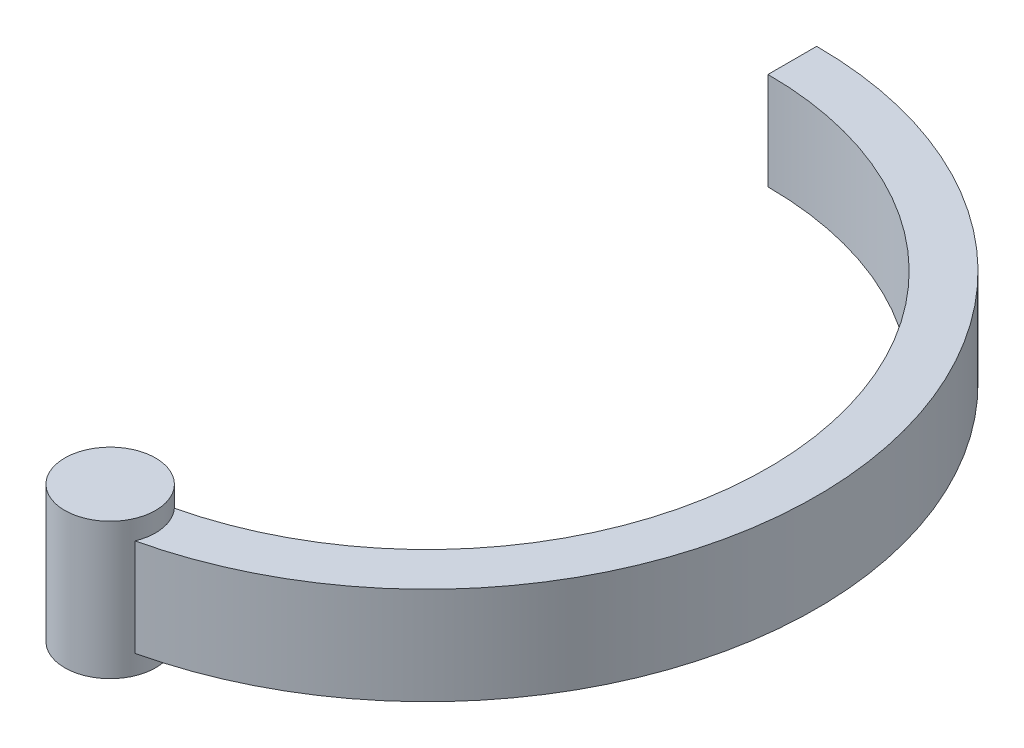
ISO-10303-21;
HEADER;
FILE_DESCRIPTION(('STEP AP214'),'2;1');
FILE_NAME('part.step','',(''),(''),'','','');
FILE_SCHEMA(('AUTOMOTIVE_DESIGN { 1 0 10303 214 1 1 1 1 }'));
ENDSEC;
DATA;
#1=APPLICATION_CONTEXT('core data for automotive mechanical design processes');
#2=APPLICATION_PROTOCOL_DEFINITION('international standard','automotive_design',2000,#1);
#3=PRODUCT_CONTEXT('',#1,'mechanical');
#4=PRODUCT('Part','Part','',(#3));
#5=PRODUCT_RELATED_PRODUCT_CATEGORY('part','',(#4));
#6=PRODUCT_DEFINITION_FORMATION('','',#4);
#7=PRODUCT_DEFINITION_CONTEXT('part definition',#1,'design');
#8=PRODUCT_DEFINITION('design','',#6,#7);
#9=PRODUCT_DEFINITION_SHAPE('','',#8);
#10=(LENGTH_UNIT() NAMED_UNIT(*) SI_UNIT(.MILLI.,.METRE.));
#11=(NAMED_UNIT(*) PLANE_ANGLE_UNIT() SI_UNIT($,.RADIAN.));
#12=(NAMED_UNIT(*) SI_UNIT($,.STERADIAN.) SOLID_ANGLE_UNIT());
#13=UNCERTAINTY_MEASURE_WITH_UNIT(LENGTH_MEASURE(1.E-05),#10,'distance_accuracy_value','');
#14=(GEOMETRIC_REPRESENTATION_CONTEXT(3) GLOBAL_UNCERTAINTY_ASSIGNED_CONTEXT((#13)) GLOBAL_UNIT_ASSIGNED_CONTEXT((#10,
#11,#12)) REPRESENTATION_CONTEXT('',''));
#15=CARTESIAN_POINT('',(0.,0.,0.));
#16=DIRECTION('',(0.,0.,1.));
#17=DIRECTION('',(1.,0.,0.));
#18=AXIS2_PLACEMENT_3D('',#15,#16,#17);
#19=CARTESIAN_POINT('',(4.66504640850441,-7.,37.208699816125));
#20=DIRECTION('',(0.,1.,0.));
#21=DIRECTION('',(0.,0.,1.));
#22=AXIS2_PLACEMENT_3D('',#19,#20,#21);
#23=CYLINDRICAL_SURFACE('',#22,4.66504640850441);
#24=CARTESIAN_POINT('',(4.66504640850441,7.,37.208699816125));
#25=DIRECTION('',(0.,1.,0.));
#26=DIRECTION('',(0.,0.,1.));
#27=AXIS2_PLACEMENT_3D('',#24,#25,#26);
#28=CIRCLE('',#27,4.66504640850441);
#29=CARTESIAN_POINT('',(4.66504640850441,7.,41.8737462246294));
#30=VERTEX_POINT('',#29);
#31=EDGE_CURVE('E42',#30,#30,#28,.T.);
#32=ORIENTED_EDGE('',*,*,#31,.F.);
#33=EDGE_LOOP('',(#32));
#34=FACE_BOUND('',#33,.T.);
#35=CARTESIAN_POINT('',(4.66504640850441,-7.,37.208699816125));
#36=DIRECTION('',(0.,1.,0.));
#37=DIRECTION('',(0.,0.,1.));
#38=AXIS2_PLACEMENT_3D('',#35,#36,#37);
#39=CIRCLE('',#38,4.66504640850441);
#40=CARTESIAN_POINT('',(4.66504640850441,-7.,41.8737462246294));
#41=VERTEX_POINT('',#40);
#42=EDGE_CURVE('E11',#41,#41,#39,.T.);
#43=ORIENTED_EDGE('',*,*,#42,.T.);
#44=EDGE_LOOP('',(#43));
#45=FACE_BOUND('',#44,.T.);
#46=DIRECTION('',(0.,1.,0.));
#47=VECTOR('',#46,1.);
#48=CARTESIAN_POINT('',(8.09823286131099,-5.,34.0502367763277));
#49=LINE('',#48,#47);
#50=CARTESIAN_POINT('',(8.09823286131099,-5.,34.0502367763277));
#51=VERTEX_POINT('',#50);
#52=CARTESIAN_POINT('',(8.09823286131105,5.,34.0502367763277));
#53=VERTEX_POINT('',#52);
#54=EDGE_CURVE('E49',#51,#53,#49,.T.);
#55=ORIENTED_EDGE('',*,*,#54,.F.);
#56=CARTESIAN_POINT('',(4.66504640850441,-5.,37.208699816125));
#57=DIRECTION('',(0.,-1.,0.));
#58=DIRECTION('',(0.,0.,1.));
#59=AXIS2_PLACEMENT_3D('',#56,#57,#58);
#60=CIRCLE('',#59,4.66504640850441);
#61=CARTESIAN_POINT('',(8.98127947699179,-5.,38.9786687683939));
#62=VERTEX_POINT('',#61);
#63=EDGE_CURVE('E53',#51,#62,#60,.T.);
#64=ORIENTED_EDGE('',*,*,#63,.T.);
#65=DIRECTION('',(0.,1.,0.));
#66=VECTOR('',#65,1.);
#67=CARTESIAN_POINT('',(8.9812794769918,-5.,38.9786687683939));
#68=LINE('',#67,#66);
#69=CARTESIAN_POINT('',(8.9812794769918,5.,38.9786687683939));
#70=VERTEX_POINT('',#69);
#71=EDGE_CURVE('E70',#62,#70,#68,.T.);
#72=ORIENTED_EDGE('',*,*,#71,.T.);
#73=CARTESIAN_POINT('',(4.66504640850441,5.,37.208699816125));
#74=DIRECTION('',(0.,-1.,0.));
#75=DIRECTION('',(0.,0.,1.));
#76=AXIS2_PLACEMENT_3D('',#73,#74,#75);
#77=CIRCLE('',#76,4.66504640850441);
#78=EDGE_CURVE('E72',#53,#70,#77,.T.);
#79=ORIENTED_EDGE('',*,*,#78,.F.);
#80=EDGE_LOOP('',(#55,#64,#72,#79));
#81=FACE_BOUND('',#80,.T.);
#82=ADVANCED_FACE('F35',(#34,#45,#81),#23,.T.);
#83=CARTESIAN_POINT('',(4.66504640850441,-7.,37.208699816125));
#84=DIRECTION('',(0.,1.,0.));
#85=DIRECTION('',(0.,0.,1.));
#86=AXIS2_PLACEMENT_3D('',#83,#84,#85);
#87=PLANE('',#86);
#88=ORIENTED_EDGE('',*,*,#42,.F.);
#89=EDGE_LOOP('',(#88));
#90=FACE_BOUND('',#89,.T.);
#91=ADVANCED_FACE('F114',(#90),#87,.F.);
#92=CARTESIAN_POINT('',(4.66504640850441,7.,37.208699816125));
#93=DIRECTION('',(0.,1.,0.));
#94=DIRECTION('',(0.,0.,1.));
#95=AXIS2_PLACEMENT_3D('',#92,#93,#94);
#96=PLANE('',#95);
#97=ORIENTED_EDGE('',*,*,#31,.T.);
#98=EDGE_LOOP('',(#97));
#99=FACE_BOUND('',#98,.T.);
#100=ADVANCED_FACE('F110',(#99),#96,.T.);
#101=CARTESIAN_POINT('',(0.,-5.,0.));
#102=DIRECTION('',(0.,1.,0.));
#103=DIRECTION('',(0.,0.,1.));
#104=AXIS2_PLACEMENT_3D('',#101,#102,#103);
#105=CYLINDRICAL_SURFACE('',#104,35.);
#106=ORIENTED_EDGE('',*,*,#54,.T.);
#107=CARTESIAN_POINT('',(0.,5.,0.));
#108=DIRECTION('',(0.,-1.,0.));
#109=DIRECTION('',(0.,0.,1.));
#110=AXIS2_PLACEMENT_3D('',#107,#108,#109);
#111=CIRCLE('',#110,35.);
#112=CARTESIAN_POINT('',(0.,5.,-35.));
#113=VERTEX_POINT('',#112);
#114=EDGE_CURVE('E87',#113,#53,#111,.T.);
#115=ORIENTED_EDGE('',*,*,#114,.F.);
#116=DIRECTION('',(0.,1.,0.));
#117=VECTOR('',#116,1.);
#118=CARTESIAN_POINT('',(0.,-5.,-35.));
#119=LINE('',#118,#117);
#120=CARTESIAN_POINT('',(0.,-5.,-35.));
#121=VERTEX_POINT('',#120);
#122=EDGE_CURVE('E104',#121,#113,#119,.T.);
#123=ORIENTED_EDGE('',*,*,#122,.F.);
#124=CARTESIAN_POINT('',(0.,-5.,0.));
#125=DIRECTION('',(0.,-1.,0.));
#126=DIRECTION('',(0.,0.,1.));
#127=AXIS2_PLACEMENT_3D('',#124,#125,#126);
#128=CIRCLE('',#127,35.);
#129=EDGE_CURVE('E92',#121,#51,#128,.T.);
#130=ORIENTED_EDGE('',*,*,#129,.T.);
#131=EDGE_LOOP('',(#106,#115,#123,#130));
#132=FACE_BOUND('',#131,.T.);
#133=ADVANCED_FACE('F121',(#132),#105,.F.);
#134=CARTESIAN_POINT('',(0.,-5.,-35.));
#135=DIRECTION('',(-1.,0.,0.));
#136=DIRECTION('',(0.,0.,1.));
#137=AXIS2_PLACEMENT_3D('',#134,#135,#136);
#138=PLANE('',#137);
#139=ORIENTED_EDGE('',*,*,#122,.T.);
#140=DIRECTION('',(0.,0.,1.));
#141=VECTOR('',#140,1.);
#142=CARTESIAN_POINT('',(0.,5.,-35.));
#143=LINE('',#142,#141);
#144=CARTESIAN_POINT('',(0.,5.,-40.));
#145=VERTEX_POINT('',#144);
#146=EDGE_CURVE('E90',#145,#113,#143,.T.);
#147=ORIENTED_EDGE('',*,*,#146,.F.);
#148=DIRECTION('',(0.,1.,0.));
#149=VECTOR('',#148,1.);
#150=CARTESIAN_POINT('',(0.,-5.,-40.));
#151=LINE('',#150,#149);
#152=CARTESIAN_POINT('',(0.,-5.,-40.));
#153=VERTEX_POINT('',#152);
#154=EDGE_CURVE('E77',#153,#145,#151,.T.);
#155=ORIENTED_EDGE('',*,*,#154,.F.);
#156=DIRECTION('',(0.,0.,1.));
#157=VECTOR('',#156,1.);
#158=CARTESIAN_POINT('',(0.,-5.,-35.));
#159=LINE('',#158,#157);
#160=EDGE_CURVE('E101',#153,#121,#159,.T.);
#161=ORIENTED_EDGE('',*,*,#160,.T.);
#162=EDGE_LOOP('',(#139,#147,#155,#161));
#163=FACE_BOUND('',#162,.T.);
#164=ADVANCED_FACE('F126',(#163),#138,.T.);
#165=CARTESIAN_POINT('',(0.,-5.,0.));
#166=DIRECTION('',(0.,1.,0.));
#167=DIRECTION('',(0.,0.,1.));
#168=AXIS2_PLACEMENT_3D('',#165,#166,#167);
#169=CYLINDRICAL_SURFACE('',#168,40.);
#170=ORIENTED_EDGE('',*,*,#154,.T.);
#171=CARTESIAN_POINT('',(0.,5.,0.));
#172=DIRECTION('',(0.,1.,0.));
#173=DIRECTION('',(0.,0.,1.));
#174=AXIS2_PLACEMENT_3D('',#171,#172,#173);
#175=CIRCLE('',#174,40.);
#176=EDGE_CURVE('E84',#70,#145,#175,.T.);
#177=ORIENTED_EDGE('',*,*,#176,.F.);
#178=ORIENTED_EDGE('',*,*,#71,.F.);
#179=CARTESIAN_POINT('',(0.,-5.,0.));
#180=DIRECTION('',(0.,1.,0.));
#181=DIRECTION('',(0.,0.,1.));
#182=AXIS2_PLACEMENT_3D('',#179,#180,#181);
#183=CIRCLE('',#182,40.);
#184=EDGE_CURVE('E99',#62,#153,#183,.T.);
#185=ORIENTED_EDGE('',*,*,#184,.T.);
#186=EDGE_LOOP('',(#170,#177,#178,#185));
#187=FACE_BOUND('',#186,.T.);
#188=ADVANCED_FACE('F89',(#187),#169,.T.);
#189=CARTESIAN_POINT('',(0.,-5.,0.));
#190=DIRECTION('',(0.,1.,0.));
#191=DIRECTION('',(0.,0.,1.));
#192=AXIS2_PLACEMENT_3D('',#189,#190,#191);
#193=PLANE('',#192);
#194=ORIENTED_EDGE('',*,*,#129,.F.);
#195=ORIENTED_EDGE('',*,*,#160,.F.);
#196=ORIENTED_EDGE('',*,*,#184,.F.);
#197=ORIENTED_EDGE('',*,*,#63,.F.);
#198=EDGE_LOOP('',(#194,#195,#196,#197));
#199=FACE_BOUND('',#198,.T.);
#200=ADVANCED_FACE('F130',(#199),#193,.F.);
#201=CARTESIAN_POINT('',(0.,5.,0.));
#202=DIRECTION('',(0.,1.,0.));
#203=DIRECTION('',(0.,0.,1.));
#204=AXIS2_PLACEMENT_3D('',#201,#202,#203);
#205=PLANE('',#204);
#206=ORIENTED_EDGE('',*,*,#114,.T.);
#207=ORIENTED_EDGE('',*,*,#78,.T.);
#208=ORIENTED_EDGE('',*,*,#176,.T.);
#209=ORIENTED_EDGE('',*,*,#146,.T.);
#210=EDGE_LOOP('',(#206,#207,#208,#209));
#211=FACE_BOUND('',#210,.T.);
#212=ADVANCED_FACE('F82',(#211),#205,.T.);
#213=CLOSED_SHELL('',(#82,#91,#100,#133,#164,#188,#200,#212));
#214=MANIFOLD_SOLID_BREP('B2',#213);
#215=ADVANCED_BREP_SHAPE_REPRESENTATION('',(#18,#214),#14);
#216=SHAPE_DEFINITION_REPRESENTATION(#9,#215);
ENDSEC;
END-ISO-10303-21;
